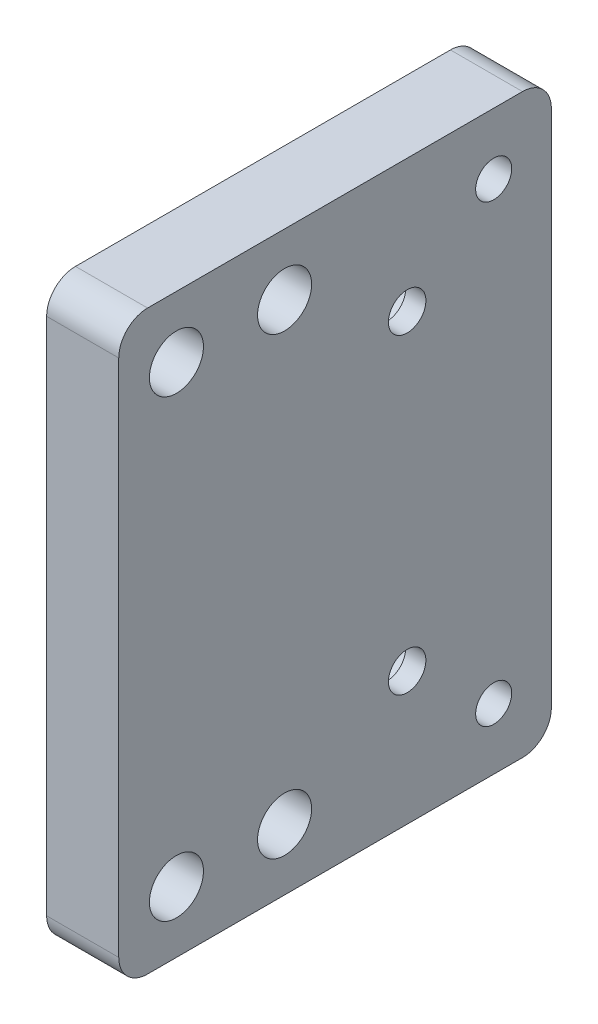
ISO-10303-21;
HEADER;
FILE_DESCRIPTION(('STEP AP214'),'2;1');
FILE_NAME('part.step','',(''),(''),'','','');
FILE_SCHEMA(('AUTOMOTIVE_DESIGN { 1 0 10303 214 1 1 1 1 }'));
ENDSEC;
DATA;
#1=APPLICATION_CONTEXT('core data for automotive mechanical design processes');
#2=APPLICATION_PROTOCOL_DEFINITION('international standard','automotive_design',2000,#1);
#3=PRODUCT_CONTEXT('',#1,'mechanical');
#4=PRODUCT('Part','Part','',(#3));
#5=PRODUCT_RELATED_PRODUCT_CATEGORY('part','',(#4));
#6=PRODUCT_DEFINITION_FORMATION('','',#4);
#7=PRODUCT_DEFINITION_CONTEXT('part definition',#1,'design');
#8=PRODUCT_DEFINITION('design','',#6,#7);
#9=PRODUCT_DEFINITION_SHAPE('','',#8);
#10=(LENGTH_UNIT() NAMED_UNIT(*) SI_UNIT(.MILLI.,.METRE.));
#11=(NAMED_UNIT(*) PLANE_ANGLE_UNIT() SI_UNIT($,.RADIAN.));
#12=(NAMED_UNIT(*) SI_UNIT($,.STERADIAN.) SOLID_ANGLE_UNIT());
#13=UNCERTAINTY_MEASURE_WITH_UNIT(LENGTH_MEASURE(1.E-05),#10,'distance_accuracy_value','');
#14=(GEOMETRIC_REPRESENTATION_CONTEXT(3) GLOBAL_UNCERTAINTY_ASSIGNED_CONTEXT((#13)) GLOBAL_UNIT_ASSIGNED_CONTEXT((#10,
#11,#12)) REPRESENTATION_CONTEXT('',''));
#15=CARTESIAN_POINT('',(0.,0.,0.));
#16=DIRECTION('',(0.,0.,1.));
#17=DIRECTION('',(1.,0.,0.));
#18=AXIS2_PLACEMENT_3D('',#15,#16,#17);
#19=CARTESIAN_POINT('',(-160.02,0.,0.));
#20=DIRECTION('',(1.,0.,0.));
#21=DIRECTION('',(0.,1.,0.));
#22=AXIS2_PLACEMENT_3D('',#19,#20,#21);
#23=PLANE('',#22);
#24=CARTESIAN_POINT('',(-160.02,174.244,12.7));
#25=DIRECTION('',(-1.,0.,0.));
#26=DIRECTION('',(0.,0.,1.));
#27=AXIS2_PLACEMENT_3D('',#24,#25,#26);
#28=CIRCLE('',#27,3.96874999999999);
#29=CARTESIAN_POINT('',(-160.02,174.244,16.66875));
#30=VERTEX_POINT('',#29);
#31=EDGE_CURVE('E321',#30,#30,#28,.T.);
#32=ORIENTED_EDGE('',*,*,#31,.F.);
#33=EDGE_LOOP('',(#32));
#34=FACE_BOUND('',#33,.T.);
#35=DIRECTION('',(0.,1.,0.));
#36=VECTOR('',#35,1.);
#37=CARTESIAN_POINT('',(-160.02,213.36,0.));
#38=LINE('',#37,#36);
#39=CARTESIAN_POINT('',(-160.02,165.1,0.));
#40=VERTEX_POINT('',#39);
#41=CARTESIAN_POINT('',(-160.02,210.82,0.));
#42=VERTEX_POINT('',#41);
#43=EDGE_CURVE('E126',#40,#42,#38,.T.);
#44=ORIENTED_EDGE('',*,*,#43,.F.);
#45=CARTESIAN_POINT('',(-160.02,165.1,2.54));
#46=DIRECTION('',(1.,0.,0.));
#47=DIRECTION('',(0.,1.,0.));
#48=AXIS2_PLACEMENT_3D('',#45,#46,#47);
#49=CIRCLE('',#48,2.54);
#50=CARTESIAN_POINT('',(-160.02,162.56,2.54000000000001));
#51=VERTEX_POINT('',#50);
#52=EDGE_CURVE('E151',#40,#51,#49,.F.);
#53=ORIENTED_EDGE('',*,*,#52,.T.);
#54=DIRECTION('',(0.,0.,-1.));
#55=VECTOR('',#54,1.);
#56=CARTESIAN_POINT('',(-160.02,162.56,38.1));
#57=LINE('',#56,#55);
#58=CARTESIAN_POINT('',(-160.02,162.56,35.56));
#59=VERTEX_POINT('',#58);
#60=EDGE_CURVE('E131',#59,#51,#57,.T.);
#61=ORIENTED_EDGE('',*,*,#60,.F.);
#62=CARTESIAN_POINT('',(-160.02,165.1,35.56));
#63=DIRECTION('',(1.,0.,0.));
#64=DIRECTION('',(0.,1.,0.));
#65=AXIS2_PLACEMENT_3D('',#62,#63,#64);
#66=CIRCLE('',#65,2.54);
#67=CARTESIAN_POINT('',(-160.02,165.1,38.1));
#68=VERTEX_POINT('',#67);
#69=EDGE_CURVE('E130',#59,#68,#66,.F.);
#70=ORIENTED_EDGE('',*,*,#69,.T.);
#71=DIRECTION('',(0.,-1.,0.));
#72=VECTOR('',#71,1.);
#73=CARTESIAN_POINT('',(-160.02,213.36,38.1));
#74=LINE('',#73,#72);
#75=CARTESIAN_POINT('',(-160.02,210.82,38.1));
#76=VERTEX_POINT('',#75);
#77=EDGE_CURVE('E135',#76,#68,#74,.T.);
#78=ORIENTED_EDGE('',*,*,#77,.F.);
#79=CARTESIAN_POINT('',(-160.02,210.82,35.56));
#80=DIRECTION('',(1.,0.,0.));
#81=DIRECTION('',(0.,1.,0.));
#82=AXIS2_PLACEMENT_3D('',#79,#80,#81);
#83=CIRCLE('',#82,2.54);
#84=CARTESIAN_POINT('',(-160.02,213.36,35.56));
#85=VERTEX_POINT('',#84);
#86=EDGE_CURVE('E54',#76,#85,#83,.F.);
#87=ORIENTED_EDGE('',*,*,#86,.T.);
#88=DIRECTION('',(0.,0.,1.));
#89=VECTOR('',#88,1.);
#90=CARTESIAN_POINT('',(-160.02,213.36,38.1));
#91=LINE('',#90,#89);
#92=CARTESIAN_POINT('',(-160.02,213.36,2.54000000000001));
#93=VERTEX_POINT('',#92);
#94=EDGE_CURVE('E216',#93,#85,#91,.T.);
#95=ORIENTED_EDGE('',*,*,#94,.F.);
#96=CARTESIAN_POINT('',(-160.02,210.82,2.54));
#97=DIRECTION('',(1.,0.,0.));
#98=DIRECTION('',(0.,1.,0.));
#99=AXIS2_PLACEMENT_3D('',#96,#97,#98);
#100=CIRCLE('',#99,2.54);
#101=EDGE_CURVE('E147',#93,#42,#100,.F.);
#102=ORIENTED_EDGE('',*,*,#101,.T.);
#103=EDGE_LOOP('',(#44,#53,#61,#70,#78,#87,#95,#102));
#104=FACE_BOUND('',#103,.T.);
#105=CARTESIAN_POINT('',(-160.02,207.9625,33.02));
#106=DIRECTION('',(1.,0.,0.));
#107=DIRECTION('',(0.,1.,0.));
#108=AXIS2_PLACEMENT_3D('',#105,#106,#107);
#109=CIRCLE('',#108,2.38124999999999);
#110=CARTESIAN_POINT('',(-160.02,210.34375,33.02));
#111=VERTEX_POINT('',#110);
#112=EDGE_CURVE('E202',#111,#111,#109,.T.);
#113=ORIENTED_EDGE('',*,*,#112,.T.);
#114=EDGE_LOOP('',(#113));
#115=FACE_BOUND('',#114,.T.);
#116=CARTESIAN_POINT('',(-160.02,167.9575,33.02));
#117=DIRECTION('',(1.,0.,0.));
#118=DIRECTION('',(0.,1.,0.));
#119=AXIS2_PLACEMENT_3D('',#116,#117,#118);
#120=CIRCLE('',#119,2.38125);
#121=CARTESIAN_POINT('',(-160.02,170.33875,33.02));
#122=VERTEX_POINT('',#121);
#123=EDGE_CURVE('E196',#122,#122,#120,.T.);
#124=ORIENTED_EDGE('',*,*,#123,.T.);
#125=EDGE_LOOP('',(#124));
#126=FACE_BOUND('',#125,.T.);
#127=CARTESIAN_POINT('',(-160.02,167.9575,23.495));
#128=DIRECTION('',(1.,0.,0.));
#129=DIRECTION('',(0.,1.,0.));
#130=AXIS2_PLACEMENT_3D('',#127,#128,#129);
#131=CIRCLE('',#130,2.38125);
#132=CARTESIAN_POINT('',(-160.02,170.33875,23.495));
#133=VERTEX_POINT('',#132);
#134=EDGE_CURVE('E190',#133,#133,#131,.T.);
#135=ORIENTED_EDGE('',*,*,#134,.T.);
#136=EDGE_LOOP('',(#135));
#137=FACE_BOUND('',#136,.T.);
#138=CARTESIAN_POINT('',(-160.02,207.9625,23.495));
#139=DIRECTION('',(1.,0.,0.));
#140=DIRECTION('',(0.,1.,0.));
#141=AXIS2_PLACEMENT_3D('',#138,#139,#140);
#142=CIRCLE('',#141,2.38125);
#143=CARTESIAN_POINT('',(-160.02,210.34375,23.495));
#144=VERTEX_POINT('',#143);
#145=EDGE_CURVE('E184',#144,#144,#142,.T.);
#146=ORIENTED_EDGE('',*,*,#145,.T.);
#147=EDGE_LOOP('',(#146));
#148=FACE_BOUND('',#147,.T.);
#149=CARTESIAN_POINT('',(-160.02,167.9575,5.07999999999999));
#150=DIRECTION('',(1.,0.,0.));
#151=DIRECTION('',(0.,1.,0.));
#152=AXIS2_PLACEMENT_3D('',#149,#150,#151);
#153=CIRCLE('',#152,1.5875);
#154=CARTESIAN_POINT('',(-160.02,169.545,5.07999999999999));
#155=VERTEX_POINT('',#154);
#156=EDGE_CURVE('E178',#155,#155,#153,.T.);
#157=ORIENTED_EDGE('',*,*,#156,.T.);
#158=EDGE_LOOP('',(#157));
#159=FACE_BOUND('',#158,.T.);
#160=CARTESIAN_POINT('',(-160.02,207.9625,5.08));
#161=DIRECTION('',(1.,0.,0.));
#162=DIRECTION('',(0.,1.,0.));
#163=AXIS2_PLACEMENT_3D('',#160,#161,#162);
#164=CIRCLE('',#163,1.5875);
#165=CARTESIAN_POINT('',(-160.02,209.55,5.08));
#166=VERTEX_POINT('',#165);
#167=EDGE_CURVE('E164',#166,#166,#164,.T.);
#168=ORIENTED_EDGE('',*,*,#167,.T.);
#169=EDGE_LOOP('',(#168));
#170=FACE_BOUND('',#169,.T.);
#171=CARTESIAN_POINT('',(-160.02,201.676,12.7));
#172=DIRECTION('',(-1.,0.,0.));
#173=DIRECTION('',(0.,0.,1.));
#174=AXIS2_PLACEMENT_3D('',#171,#172,#173);
#175=CIRCLE('',#174,3.96874999999999);
#176=CARTESIAN_POINT('',(-160.02,201.676,16.66875));
#177=VERTEX_POINT('',#176);
#178=EDGE_CURVE('E167',#177,#177,#175,.T.);
#179=ORIENTED_EDGE('',*,*,#178,.F.);
#180=EDGE_LOOP('',(#179));
#181=FACE_BOUND('',#180,.T.);
#182=ADVANCED_FACE('F37',(#34,#104,#115,#126,#137,#148,#159,#170,#181),#23,.F.);
#183=CARTESIAN_POINT('',(-160.02,213.36,0.));
#184=DIRECTION('',(0.,0.,-1.));
#185=DIRECTION('',(-1.,0.,0.));
#186=AXIS2_PLACEMENT_3D('',#183,#184,#185);
#187=PLANE('',#186);
#188=DIRECTION('',(0.,1.,0.));
#189=VECTOR('',#188,1.);
#190=CARTESIAN_POINT('',(-153.67,213.36,0.));
#191=LINE('',#190,#189);
#192=CARTESIAN_POINT('',(-153.67,165.1,0.));
#193=VERTEX_POINT('',#192);
#194=CARTESIAN_POINT('',(-153.67,210.82,0.));
#195=VERTEX_POINT('',#194);
#196=EDGE_CURVE('E213',#193,#195,#191,.T.);
#197=ORIENTED_EDGE('',*,*,#196,.F.);
#198=DIRECTION('',(1.,0.,0.));
#199=VECTOR('',#198,1.);
#200=CARTESIAN_POINT('',(-160.02,165.1,0.));
#201=LINE('',#200,#199);
#202=EDGE_CURVE('E145',#193,#40,#201,.F.);
#203=ORIENTED_EDGE('',*,*,#202,.T.);
#204=ORIENTED_EDGE('',*,*,#43,.T.);
#205=DIRECTION('',(1.,0.,0.));
#206=VECTOR('',#205,1.);
#207=CARTESIAN_POINT('',(-160.02,210.82,0.));
#208=LINE('',#207,#206);
#209=EDGE_CURVE('E142',#42,#195,#208,.T.);
#210=ORIENTED_EDGE('',*,*,#209,.T.);
#211=EDGE_LOOP('',(#197,#203,#204,#210));
#212=FACE_BOUND('',#211,.T.);
#213=ADVANCED_FACE('F234',(#212),#187,.T.);
#214=CARTESIAN_POINT('',(-160.02,162.56,38.1));
#215=DIRECTION('',(0.,-1.,0.));
#216=DIRECTION('',(1.,0.,0.));
#217=AXIS2_PLACEMENT_3D('',#214,#215,#216);
#218=PLANE('',#217);
#219=ORIENTED_EDGE('',*,*,#60,.T.);
#220=DIRECTION('',(1.,0.,0.));
#221=VECTOR('',#220,1.);
#222=CARTESIAN_POINT('',(-160.02,162.56,2.54));
#223=LINE('',#222,#221);
#224=CARTESIAN_POINT('',(-153.67,162.56,2.54000000000001));
#225=VERTEX_POINT('',#224);
#226=EDGE_CURVE('E125',#51,#225,#223,.T.);
#227=ORIENTED_EDGE('',*,*,#226,.T.);
#228=DIRECTION('',(0.,0.,-1.));
#229=VECTOR('',#228,1.);
#230=CARTESIAN_POINT('',(-153.67,162.56,38.1));
#231=LINE('',#230,#229);
#232=CARTESIAN_POINT('',(-153.67,162.56,35.56));
#233=VERTEX_POINT('',#232);
#234=EDGE_CURVE('E108',#233,#225,#231,.T.);
#235=ORIENTED_EDGE('',*,*,#234,.F.);
#236=DIRECTION('',(1.,0.,0.));
#237=VECTOR('',#236,1.);
#238=CARTESIAN_POINT('',(-160.02,162.56,35.56));
#239=LINE('',#238,#237);
#240=EDGE_CURVE('E122',#233,#59,#239,.F.);
#241=ORIENTED_EDGE('',*,*,#240,.T.);
#242=EDGE_LOOP('',(#219,#227,#235,#241));
#243=FACE_BOUND('',#242,.T.);
#244=ADVANCED_FACE('F121',(#243),#218,.T.);
#245=CARTESIAN_POINT('',(-160.02,213.36,38.1));
#246=DIRECTION('',(0.,0.,1.));
#247=DIRECTION('',(1.,0.,0.));
#248=AXIS2_PLACEMENT_3D('',#245,#246,#247);
#249=PLANE('',#248);
#250=ORIENTED_EDGE('',*,*,#77,.T.);
#251=DIRECTION('',(1.,0.,0.));
#252=VECTOR('',#251,1.);
#253=CARTESIAN_POINT('',(-160.02,165.1,38.1));
#254=LINE('',#253,#252);
#255=CARTESIAN_POINT('',(-153.67,165.1,38.1));
#256=VERTEX_POINT('',#255);
#257=EDGE_CURVE('E155',#68,#256,#254,.T.);
#258=ORIENTED_EDGE('',*,*,#257,.T.);
#259=DIRECTION('',(0.,-1.,0.));
#260=VECTOR('',#259,1.);
#261=CARTESIAN_POINT('',(-153.67,213.36,38.1));
#262=LINE('',#261,#260);
#263=CARTESIAN_POINT('',(-153.67,210.82,38.1));
#264=VERTEX_POINT('',#263);
#265=EDGE_CURVE('E110',#264,#256,#262,.T.);
#266=ORIENTED_EDGE('',*,*,#265,.F.);
#267=DIRECTION('',(1.,0.,0.));
#268=VECTOR('',#267,1.);
#269=CARTESIAN_POINT('',(-160.02,210.82,38.1));
#270=LINE('',#269,#268);
#271=EDGE_CURVE('E153',#264,#76,#270,.F.);
#272=ORIENTED_EDGE('',*,*,#271,.T.);
#273=EDGE_LOOP('',(#250,#258,#266,#272));
#274=FACE_BOUND('',#273,.T.);
#275=ADVANCED_FACE('F239',(#274),#249,.T.);
#276=CARTESIAN_POINT('',(-160.02,213.36,38.1));
#277=DIRECTION('',(0.,1.,0.));
#278=DIRECTION('',(-1.,0.,0.));
#279=AXIS2_PLACEMENT_3D('',#276,#277,#278);
#280=PLANE('',#279);
#281=ORIENTED_EDGE('',*,*,#94,.T.);
#282=DIRECTION('',(1.,0.,0.));
#283=VECTOR('',#282,1.);
#284=CARTESIAN_POINT('',(-160.02,213.36,35.56));
#285=LINE('',#284,#283);
#286=CARTESIAN_POINT('',(-153.67,213.36,35.56));
#287=VERTEX_POINT('',#286);
#288=EDGE_CURVE('E11',#85,#287,#285,.T.);
#289=ORIENTED_EDGE('',*,*,#288,.T.);
#290=DIRECTION('',(0.,0.,1.));
#291=VECTOR('',#290,1.);
#292=CARTESIAN_POINT('',(-153.67,213.36,38.1));
#293=LINE('',#292,#291);
#294=CARTESIAN_POINT('',(-153.67,213.36,2.54000000000001));
#295=VERTEX_POINT('',#294);
#296=EDGE_CURVE('E222',#295,#287,#293,.T.);
#297=ORIENTED_EDGE('',*,*,#296,.F.);
#298=DIRECTION('',(1.,0.,0.));
#299=VECTOR('',#298,1.);
#300=CARTESIAN_POINT('',(-160.02,213.36,2.54));
#301=LINE('',#300,#299);
#302=EDGE_CURVE('E46',#295,#93,#301,.F.);
#303=ORIENTED_EDGE('',*,*,#302,.T.);
#304=EDGE_LOOP('',(#281,#289,#297,#303));
#305=FACE_BOUND('',#304,.T.);
#306=ADVANCED_FACE('F224',(#305),#280,.T.);
#307=CARTESIAN_POINT('',(-153.67,0.,0.));
#308=DIRECTION('',(1.,0.,0.));
#309=DIRECTION('',(0.,1.,0.));
#310=AXIS2_PLACEMENT_3D('',#307,#308,#309);
#311=PLANE('',#310);
#312=CARTESIAN_POINT('',(-153.67,207.9625,5.08));
#313=DIRECTION('',(1.,0.,0.));
#314=DIRECTION('',(0.,1.,0.));
#315=AXIS2_PLACEMENT_3D('',#312,#313,#314);
#316=CIRCLE('',#315,1.5875);
#317=CARTESIAN_POINT('',(-153.67,209.55,5.08));
#318=VERTEX_POINT('',#317);
#319=EDGE_CURVE('E159',#318,#318,#316,.T.);
#320=ORIENTED_EDGE('',*,*,#319,.F.);
#321=EDGE_LOOP('',(#320));
#322=FACE_BOUND('',#321,.T.);
#323=CARTESIAN_POINT('',(-153.67,167.9575,5.07999999999999));
#324=DIRECTION('',(1.,0.,0.));
#325=DIRECTION('',(0.,1.,0.));
#326=AXIS2_PLACEMENT_3D('',#323,#324,#325);
#327=CIRCLE('',#326,1.5875);
#328=CARTESIAN_POINT('',(-153.67,169.545,5.07999999999999));
#329=VERTEX_POINT('',#328);
#330=EDGE_CURVE('E176',#329,#329,#327,.T.);
#331=ORIENTED_EDGE('',*,*,#330,.F.);
#332=EDGE_LOOP('',(#331));
#333=FACE_BOUND('',#332,.T.);
#334=CARTESIAN_POINT('',(-153.67,207.9625,23.495));
#335=DIRECTION('',(1.,0.,0.));
#336=DIRECTION('',(0.,1.,0.));
#337=AXIS2_PLACEMENT_3D('',#334,#335,#336);
#338=CIRCLE('',#337,2.38125);
#339=CARTESIAN_POINT('',(-153.67,210.34375,23.495));
#340=VERTEX_POINT('',#339);
#341=EDGE_CURVE('E181',#340,#340,#338,.T.);
#342=ORIENTED_EDGE('',*,*,#341,.F.);
#343=EDGE_LOOP('',(#342));
#344=FACE_BOUND('',#343,.T.);
#345=CARTESIAN_POINT('',(-153.67,167.9575,23.495));
#346=DIRECTION('',(1.,0.,0.));
#347=DIRECTION('',(0.,1.,0.));
#348=AXIS2_PLACEMENT_3D('',#345,#346,#347);
#349=CIRCLE('',#348,2.38125);
#350=CARTESIAN_POINT('',(-153.67,170.33875,23.495));
#351=VERTEX_POINT('',#350);
#352=EDGE_CURVE('E187',#351,#351,#349,.T.);
#353=ORIENTED_EDGE('',*,*,#352,.F.);
#354=EDGE_LOOP('',(#353));
#355=FACE_BOUND('',#354,.T.);
#356=CARTESIAN_POINT('',(-153.67,167.9575,33.02));
#357=DIRECTION('',(1.,0.,0.));
#358=DIRECTION('',(0.,1.,0.));
#359=AXIS2_PLACEMENT_3D('',#356,#357,#358);
#360=CIRCLE('',#359,2.38125);
#361=CARTESIAN_POINT('',(-153.67,170.33875,33.02));
#362=VERTEX_POINT('',#361);
#363=EDGE_CURVE('E193',#362,#362,#360,.T.);
#364=ORIENTED_EDGE('',*,*,#363,.F.);
#365=EDGE_LOOP('',(#364));
#366=FACE_BOUND('',#365,.T.);
#367=CARTESIAN_POINT('',(-153.67,207.9625,33.02));
#368=DIRECTION('',(1.,0.,0.));
#369=DIRECTION('',(0.,1.,0.));
#370=AXIS2_PLACEMENT_3D('',#367,#368,#369);
#371=CIRCLE('',#370,2.38124999999999);
#372=CARTESIAN_POINT('',(-153.67,210.34375,33.02));
#373=VERTEX_POINT('',#372);
#374=EDGE_CURVE('E199',#373,#373,#371,.T.);
#375=ORIENTED_EDGE('',*,*,#374,.F.);
#376=EDGE_LOOP('',(#375));
#377=FACE_BOUND('',#376,.T.);
#378=CARTESIAN_POINT('',(-153.67,174.244,12.7));
#379=DIRECTION('',(1.,0.,0.));
#380=DIRECTION('',(0.,1.,0.));
#381=AXIS2_PLACEMENT_3D('',#378,#379,#380);
#382=CIRCLE('',#381,1.651);
#383=CARTESIAN_POINT('',(-153.67,175.895,12.7));
#384=VERTEX_POINT('',#383);
#385=EDGE_CURVE('E205',#384,#384,#382,.T.);
#386=ORIENTED_EDGE('',*,*,#385,.F.);
#387=EDGE_LOOP('',(#386));
#388=FACE_BOUND('',#387,.T.);
#389=CARTESIAN_POINT('',(-153.67,201.676,12.7));
#390=DIRECTION('',(1.,0.,0.));
#391=DIRECTION('',(0.,1.,0.));
#392=AXIS2_PLACEMENT_3D('',#389,#390,#391);
#393=CIRCLE('',#392,1.651);
#394=CARTESIAN_POINT('',(-153.67,203.327,12.7));
#395=VERTEX_POINT('',#394);
#396=EDGE_CURVE('E210',#395,#395,#393,.T.);
#397=ORIENTED_EDGE('',*,*,#396,.F.);
#398=EDGE_LOOP('',(#397));
#399=FACE_BOUND('',#398,.T.);
#400=ORIENTED_EDGE('',*,*,#234,.T.);
#401=CARTESIAN_POINT('',(-153.67,165.1,2.54));
#402=DIRECTION('',(1.,0.,0.));
#403=DIRECTION('',(0.,1.,0.));
#404=AXIS2_PLACEMENT_3D('',#401,#402,#403);
#405=CIRCLE('',#404,2.54);
#406=EDGE_CURVE('E115',#225,#193,#405,.T.);
#407=ORIENTED_EDGE('',*,*,#406,.T.);
#408=ORIENTED_EDGE('',*,*,#196,.T.);
#409=CARTESIAN_POINT('',(-153.67,210.82,2.54));
#410=DIRECTION('',(1.,0.,0.));
#411=DIRECTION('',(0.,1.,0.));
#412=AXIS2_PLACEMENT_3D('',#409,#410,#411);
#413=CIRCLE('',#412,2.54);
#414=EDGE_CURVE('E133',#195,#295,#413,.T.);
#415=ORIENTED_EDGE('',*,*,#414,.T.);
#416=ORIENTED_EDGE('',*,*,#296,.T.);
#417=CARTESIAN_POINT('',(-153.67,210.82,35.56));
#418=DIRECTION('',(1.,0.,0.));
#419=DIRECTION('',(0.,1.,0.));
#420=AXIS2_PLACEMENT_3D('',#417,#418,#419);
#421=CIRCLE('',#420,2.54);
#422=EDGE_CURVE('E116',#287,#264,#421,.T.);
#423=ORIENTED_EDGE('',*,*,#422,.T.);
#424=ORIENTED_EDGE('',*,*,#265,.T.);
#425=CARTESIAN_POINT('',(-153.67,165.1,35.56));
#426=DIRECTION('',(1.,0.,0.));
#427=DIRECTION('',(0.,1.,0.));
#428=AXIS2_PLACEMENT_3D('',#425,#426,#427);
#429=CIRCLE('',#428,2.54);
#430=EDGE_CURVE('E105',#256,#233,#429,.T.);
#431=ORIENTED_EDGE('',*,*,#430,.T.);
#432=EDGE_LOOP('',(#400,#407,#408,#415,#416,#423,#424,#431));
#433=FACE_BOUND('',#432,.T.);
#434=ADVANCED_FACE('F107',(#322,#333,#344,#355,#366,#377,#388,#399,#433),#311,.T.);
#435=CARTESIAN_POINT('',(-160.02,201.676,12.7));
#436=DIRECTION('',(1.,0.,0.));
#437=DIRECTION('',(0.,1.,0.));
#438=AXIS2_PLACEMENT_3D('',#435,#436,#437);
#439=CYLINDRICAL_SURFACE('',#438,1.651);
#440=CARTESIAN_POINT('',(-155.452355300249,201.676,12.7));
#441=DIRECTION('',(-1.,0.,0.));
#442=DIRECTION('',(0.,0.,1.));
#443=AXIS2_PLACEMENT_3D('',#440,#441,#442);
#444=CIRCLE('',#443,1.651);
#445=CARTESIAN_POINT('',(-155.452355300249,201.676,14.351));
#446=VERTEX_POINT('',#445);
#447=EDGE_CURVE('E157',#446,#446,#444,.T.);
#448=ORIENTED_EDGE('',*,*,#447,.T.);
#449=EDGE_LOOP('',(#448));
#450=FACE_BOUND('',#449,.T.);
#451=ORIENTED_EDGE('',*,*,#396,.T.);
#452=EDGE_LOOP('',(#451));
#453=FACE_BOUND('',#452,.T.);
#454=ADVANCED_FACE('F260',(#450,#453),#439,.F.);
#455=CARTESIAN_POINT('',(-160.02,174.244,12.7));
#456=DIRECTION('',(1.,0.,0.));
#457=DIRECTION('',(0.,1.,0.));
#458=AXIS2_PLACEMENT_3D('',#455,#456,#457);
#459=CYLINDRICAL_SURFACE('',#458,1.651);
#460=CARTESIAN_POINT('',(-155.452355300249,174.244,12.7));
#461=DIRECTION('',(-1.,0.,0.));
#462=DIRECTION('',(0.,0.,1.));
#463=AXIS2_PLACEMENT_3D('',#460,#461,#462);
#464=CIRCLE('',#463,1.651);
#465=CARTESIAN_POINT('',(-155.452355300249,174.244,14.351));
#466=VERTEX_POINT('',#465);
#467=EDGE_CURVE('E41',#466,#466,#464,.T.);
#468=ORIENTED_EDGE('',*,*,#467,.T.);
#469=EDGE_LOOP('',(#468));
#470=FACE_BOUND('',#469,.T.);
#471=ORIENTED_EDGE('',*,*,#385,.T.);
#472=EDGE_LOOP('',(#471));
#473=FACE_BOUND('',#472,.T.);
#474=ADVANCED_FACE('F303',(#470,#473),#459,.F.);
#475=CARTESIAN_POINT('',(-160.02,207.9625,33.02));
#476=DIRECTION('',(1.,0.,0.));
#477=DIRECTION('',(0.,1.,0.));
#478=AXIS2_PLACEMENT_3D('',#475,#476,#477);
#479=CYLINDRICAL_SURFACE('',#478,2.38124999999999);
#480=ORIENTED_EDGE('',*,*,#112,.F.);
#481=EDGE_LOOP('',(#480));
#482=FACE_BOUND('',#481,.T.);
#483=ORIENTED_EDGE('',*,*,#374,.T.);
#484=EDGE_LOOP('',(#483));
#485=FACE_BOUND('',#484,.T.);
#486=ADVANCED_FACE('F300',(#482,#485),#479,.F.);
#487=CARTESIAN_POINT('',(-160.02,167.9575,33.02));
#488=DIRECTION('',(1.,0.,0.));
#489=DIRECTION('',(0.,1.,0.));
#490=AXIS2_PLACEMENT_3D('',#487,#488,#489);
#491=CYLINDRICAL_SURFACE('',#490,2.38125);
#492=ORIENTED_EDGE('',*,*,#123,.F.);
#493=EDGE_LOOP('',(#492));
#494=FACE_BOUND('',#493,.T.);
#495=ORIENTED_EDGE('',*,*,#363,.T.);
#496=EDGE_LOOP('',(#495));
#497=FACE_BOUND('',#496,.T.);
#498=ADVANCED_FACE('F296',(#494,#497),#491,.F.);
#499=CARTESIAN_POINT('',(-160.02,167.9575,23.495));
#500=DIRECTION('',(1.,0.,0.));
#501=DIRECTION('',(0.,1.,0.));
#502=AXIS2_PLACEMENT_3D('',#499,#500,#501);
#503=CYLINDRICAL_SURFACE('',#502,2.38125);
#504=ORIENTED_EDGE('',*,*,#134,.F.);
#505=EDGE_LOOP('',(#504));
#506=FACE_BOUND('',#505,.T.);
#507=ORIENTED_EDGE('',*,*,#352,.T.);
#508=EDGE_LOOP('',(#507));
#509=FACE_BOUND('',#508,.T.);
#510=ADVANCED_FACE('F292',(#506,#509),#503,.F.);
#511=CARTESIAN_POINT('',(-160.02,207.9625,23.495));
#512=DIRECTION('',(1.,0.,0.));
#513=DIRECTION('',(0.,1.,0.));
#514=AXIS2_PLACEMENT_3D('',#511,#512,#513);
#515=CYLINDRICAL_SURFACE('',#514,2.38125);
#516=ORIENTED_EDGE('',*,*,#145,.F.);
#517=EDGE_LOOP('',(#516));
#518=FACE_BOUND('',#517,.T.);
#519=ORIENTED_EDGE('',*,*,#341,.T.);
#520=EDGE_LOOP('',(#519));
#521=FACE_BOUND('',#520,.T.);
#522=ADVANCED_FACE('F282',(#518,#521),#515,.F.);
#523=CARTESIAN_POINT('',(-160.02,167.9575,5.07999999999999));
#524=DIRECTION('',(1.,0.,0.));
#525=DIRECTION('',(0.,1.,0.));
#526=AXIS2_PLACEMENT_3D('',#523,#524,#525);
#527=CYLINDRICAL_SURFACE('',#526,1.5875);
#528=ORIENTED_EDGE('',*,*,#156,.F.);
#529=EDGE_LOOP('',(#528));
#530=FACE_BOUND('',#529,.T.);
#531=ORIENTED_EDGE('',*,*,#330,.T.);
#532=EDGE_LOOP('',(#531));
#533=FACE_BOUND('',#532,.T.);
#534=ADVANCED_FACE('F276',(#530,#533),#527,.F.);
#535=CARTESIAN_POINT('',(-160.02,207.9625,5.08));
#536=DIRECTION('',(1.,0.,0.));
#537=DIRECTION('',(0.,1.,0.));
#538=AXIS2_PLACEMENT_3D('',#535,#536,#537);
#539=CYLINDRICAL_SURFACE('',#538,1.5875);
#540=ORIENTED_EDGE('',*,*,#167,.F.);
#541=EDGE_LOOP('',(#540));
#542=FACE_BOUND('',#541,.T.);
#543=ORIENTED_EDGE('',*,*,#319,.T.);
#544=EDGE_LOOP('',(#543));
#545=FACE_BOUND('',#544,.T.);
#546=ADVANCED_FACE('F272',(#542,#545),#539,.F.);
#547=CARTESIAN_POINT('',(-160.02,165.1,2.54));
#548=DIRECTION('',(1.,0.,0.));
#549=DIRECTION('',(0.,1.,0.));
#550=AXIS2_PLACEMENT_3D('',#547,#548,#549);
#551=CYLINDRICAL_SURFACE('',#550,2.54);
#552=ORIENTED_EDGE('',*,*,#52,.F.);
#553=ORIENTED_EDGE('',*,*,#202,.F.);
#554=ORIENTED_EDGE('',*,*,#406,.F.);
#555=ORIENTED_EDGE('',*,*,#226,.F.);
#556=EDGE_LOOP('',(#552,#553,#554,#555));
#557=FACE_BOUND('',#556,.T.);
#558=ADVANCED_FACE('F237',(#557),#551,.T.);
#559=CARTESIAN_POINT('',(-160.02,165.1,35.56));
#560=DIRECTION('',(1.,0.,0.));
#561=DIRECTION('',(0.,1.,0.));
#562=AXIS2_PLACEMENT_3D('',#559,#560,#561);
#563=CYLINDRICAL_SURFACE('',#562,2.54);
#564=ORIENTED_EDGE('',*,*,#69,.F.);
#565=ORIENTED_EDGE('',*,*,#240,.F.);
#566=ORIENTED_EDGE('',*,*,#430,.F.);
#567=ORIENTED_EDGE('',*,*,#257,.F.);
#568=EDGE_LOOP('',(#564,#565,#566,#567));
#569=FACE_BOUND('',#568,.T.);
#570=ADVANCED_FACE('F129',(#569),#563,.T.);
#571=CARTESIAN_POINT('',(-160.02,210.82,35.56));
#572=DIRECTION('',(1.,0.,0.));
#573=DIRECTION('',(0.,1.,0.));
#574=AXIS2_PLACEMENT_3D('',#571,#572,#573);
#575=CYLINDRICAL_SURFACE('',#574,2.54);
#576=ORIENTED_EDGE('',*,*,#86,.F.);
#577=ORIENTED_EDGE('',*,*,#271,.F.);
#578=ORIENTED_EDGE('',*,*,#422,.F.);
#579=ORIENTED_EDGE('',*,*,#288,.F.);
#580=EDGE_LOOP('',(#576,#577,#578,#579));
#581=FACE_BOUND('',#580,.T.);
#582=ADVANCED_FACE('F242',(#581),#575,.T.);
#583=CARTESIAN_POINT('',(-160.02,210.82,2.54));
#584=DIRECTION('',(1.,0.,0.));
#585=DIRECTION('',(0.,1.,0.));
#586=AXIS2_PLACEMENT_3D('',#583,#584,#585);
#587=CYLINDRICAL_SURFACE('',#586,2.54);
#588=ORIENTED_EDGE('',*,*,#101,.F.);
#589=ORIENTED_EDGE('',*,*,#302,.F.);
#590=ORIENTED_EDGE('',*,*,#414,.F.);
#591=ORIENTED_EDGE('',*,*,#209,.F.);
#592=EDGE_LOOP('',(#588,#589,#590,#591));
#593=FACE_BOUND('',#592,.T.);
#594=ADVANCED_FACE('F39',(#593),#587,.T.);
#595=CARTESIAN_POINT('',(-156.845,201.676,12.7));
#596=DIRECTION('',(-1.,0.,0.));
#597=DIRECTION('',(0.,0.,1.));
#598=AXIS2_PLACEMENT_3D('',#595,#596,#597);
#599=CONICAL_SURFACE('',#598,3.96874999999999,1.02974425867666);
#600=CARTESIAN_POINT('',(-156.845,201.676,12.7));
#601=DIRECTION('',(-1.,0.,0.));
#602=DIRECTION('',(0.,0.,1.));
#603=AXIS2_PLACEMENT_3D('',#600,#601,#602);
#604=CIRCLE('',#603,3.96874999999999);
#605=CARTESIAN_POINT('',(-156.845,201.676,16.66875));
#606=VERTEX_POINT('',#605);
#607=EDGE_CURVE('E160',#606,#606,#604,.T.);
#608=ORIENTED_EDGE('',*,*,#607,.T.);
#609=EDGE_LOOP('',(#608));
#610=FACE_BOUND('',#609,.T.);
#611=ORIENTED_EDGE('',*,*,#447,.F.);
#612=EDGE_LOOP('',(#611));
#613=FACE_BOUND('',#612,.T.);
#614=ADVANCED_FACE('F248',(#610,#613),#599,.F.);
#615=CARTESIAN_POINT('',(-160.02,201.676,12.7));
#616=DIRECTION('',(-1.,0.,0.));
#617=DIRECTION('',(0.,0.,1.));
#618=AXIS2_PLACEMENT_3D('',#615,#616,#617);
#619=CYLINDRICAL_SURFACE('',#618,3.96874999999999);
#620=ORIENTED_EDGE('',*,*,#607,.F.);
#621=EDGE_LOOP('',(#620));
#622=FACE_BOUND('',#621,.T.);
#623=ORIENTED_EDGE('',*,*,#178,.T.);
#624=EDGE_LOOP('',(#623));
#625=FACE_BOUND('',#624,.T.);
#626=ADVANCED_FACE('F335',(#622,#625),#619,.F.);
#627=CARTESIAN_POINT('',(-156.845,174.244,12.7));
#628=DIRECTION('',(-1.,0.,0.));
#629=DIRECTION('',(0.,0.,1.));
#630=AXIS2_PLACEMENT_3D('',#627,#628,#629);
#631=CONICAL_SURFACE('',#630,3.96874999999999,1.02974425867666);
#632=CARTESIAN_POINT('',(-156.845,174.244,12.7));
#633=DIRECTION('',(-1.,0.,0.));
#634=DIRECTION('',(0.,0.,1.));
#635=AXIS2_PLACEMENT_3D('',#632,#633,#634);
#636=CIRCLE('',#635,3.96874999999999);
#637=CARTESIAN_POINT('',(-156.845,174.244,16.66875));
#638=VERTEX_POINT('',#637);
#639=EDGE_CURVE('E319',#638,#638,#636,.T.);
#640=ORIENTED_EDGE('',*,*,#639,.T.);
#641=EDGE_LOOP('',(#640));
#642=FACE_BOUND('',#641,.T.);
#643=ORIENTED_EDGE('',*,*,#467,.F.);
#644=EDGE_LOOP('',(#643));
#645=FACE_BOUND('',#644,.T.);
#646=ADVANCED_FACE('F329',(#642,#645),#631,.F.);
#647=CARTESIAN_POINT('',(-160.02,174.244,12.7));
#648=DIRECTION('',(-1.,0.,0.));
#649=DIRECTION('',(0.,0.,1.));
#650=AXIS2_PLACEMENT_3D('',#647,#648,#649);
#651=CYLINDRICAL_SURFACE('',#650,3.96874999999999);
#652=ORIENTED_EDGE('',*,*,#639,.F.);
#653=EDGE_LOOP('',(#652));
#654=FACE_BOUND('',#653,.T.);
#655=ORIENTED_EDGE('',*,*,#31,.T.);
#656=EDGE_LOOP('',(#655));
#657=FACE_BOUND('',#656,.T.);
#658=ADVANCED_FACE('F327',(#654,#657),#651,.F.);
#659=CLOSED_SHELL('',(#182,#213,#244,#275,#306,#434,#454,#474,#486,#498,#510,#522,#534,#546,
#558,#570,#582,#594,#614,#626,#646,#658));
#660=MANIFOLD_SOLID_BREP('B2',#659);
#661=ADVANCED_BREP_SHAPE_REPRESENTATION('',(#18,#660),#14);
#662=SHAPE_DEFINITION_REPRESENTATION(#9,#661);
ENDSEC;
END-ISO-10303-21;
